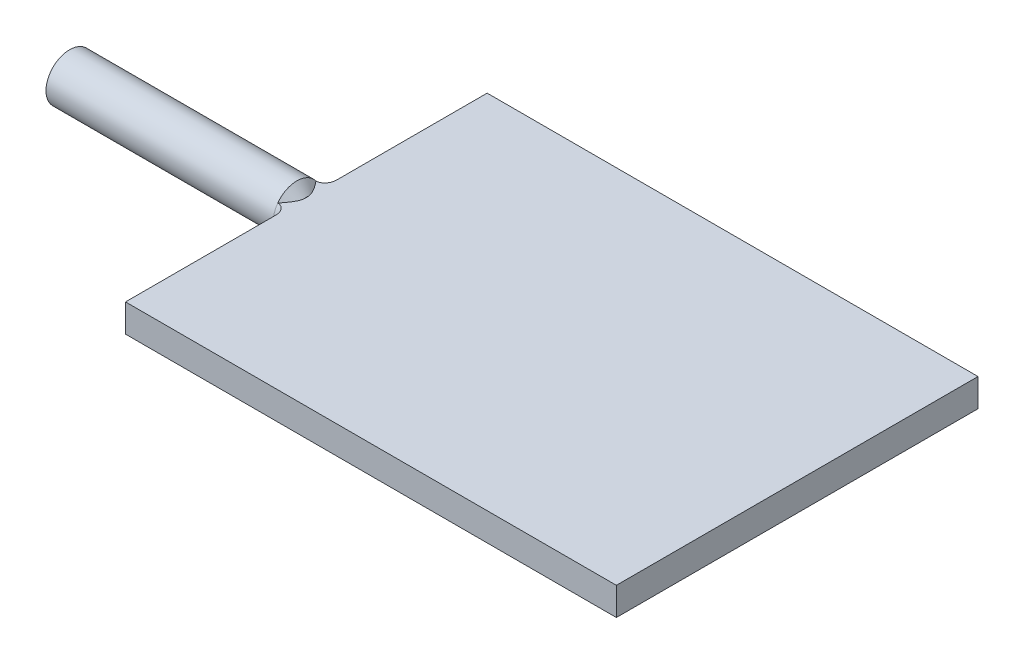
ISO-10303-21;
HEADER;
FILE_DESCRIPTION(('STEP AP214'),'2;1');
FILE_NAME('part.step','',(''),(''),'','','');
FILE_SCHEMA(('AUTOMOTIVE_DESIGN { 1 0 10303 214 1 1 1 1 }'));
ENDSEC;
DATA;
#1=APPLICATION_CONTEXT('core data for automotive mechanical design processes');
#2=APPLICATION_PROTOCOL_DEFINITION('international standard','automotive_design',2000,#1);
#3=PRODUCT_CONTEXT('',#1,'mechanical');
#4=PRODUCT('Part','Part','',(#3));
#5=PRODUCT_RELATED_PRODUCT_CATEGORY('part','',(#4));
#6=PRODUCT_DEFINITION_FORMATION('','',#4);
#7=PRODUCT_DEFINITION_CONTEXT('part definition',#1,'design');
#8=PRODUCT_DEFINITION('design','',#6,#7);
#9=PRODUCT_DEFINITION_SHAPE('','',#8);
#10=(LENGTH_UNIT() NAMED_UNIT(*) SI_UNIT(.MILLI.,.METRE.));
#11=(NAMED_UNIT(*) PLANE_ANGLE_UNIT() SI_UNIT($,.RADIAN.));
#12=(NAMED_UNIT(*) SI_UNIT($,.STERADIAN.) SOLID_ANGLE_UNIT());
#13=UNCERTAINTY_MEASURE_WITH_UNIT(LENGTH_MEASURE(1.E-05),#10,'distance_accuracy_value','');
#14=(GEOMETRIC_REPRESENTATION_CONTEXT(3) GLOBAL_UNCERTAINTY_ASSIGNED_CONTEXT((#13)) GLOBAL_UNIT_ASSIGNED_CONTEXT((#10,
#11,#12)) REPRESENTATION_CONTEXT('',''));
#15=CARTESIAN_POINT('',(0.,0.,0.));
#16=DIRECTION('',(0.,0.,1.));
#17=DIRECTION('',(1.,0.,0.));
#18=AXIS2_PLACEMENT_3D('',#15,#16,#17);
#19=CARTESIAN_POINT('',(-25.9625008107106,0.,0.));
#20=DIRECTION('',(-1.,0.,0.));
#21=DIRECTION('',(0.,0.,1.));
#22=AXIS2_PLACEMENT_3D('',#19,#20,#21);
#23=PLANE('',#22);
#24=DIRECTION('',(0.,0.,1.));
#25=VECTOR('',#24,1.);
#26=CARTESIAN_POINT('',(-25.9625008107106,5.35355371721896,0.));
#27=LINE('',#26,#25);
#28=CARTESIAN_POINT('',(-25.9625008107106,5.35355371721896,-32.0955552733691));
#29=VERTEX_POINT('',#28);
#30=CARTESIAN_POINT('',(-25.9625008107106,5.35355371721896,-16.1695708687939));
#31=VERTEX_POINT('',#30);
#32=EDGE_CURVE('E160',#29,#31,#27,.T.);
#33=ORIENTED_EDGE('',*,*,#32,.T.);
#34=CARTESIAN_POINT('',(-25.9625008107106,6.82855371721896,-12.9955552733691));
#35=DIRECTION('',(-1.,0.,0.));
#36=DIRECTION('',(0.,0.,1.));
#37=AXIS2_PLACEMENT_3D('',#34,#35,#36);
#38=CIRCLE('',#37,3.5);
#39=CARTESIAN_POINT('',(-25.9625008107106,8.30355371721896,-16.1695708687939));
#40=VERTEX_POINT('',#39);
#41=EDGE_CURVE('E193',#31,#40,#38,.F.);
#42=ORIENTED_EDGE('',*,*,#41,.T.);
#43=DIRECTION('',(0.,0.,1.));
#44=VECTOR('',#43,1.);
#45=CARTESIAN_POINT('',(-25.9625008107106,8.30355371721896,0.));
#46=LINE('',#45,#44);
#47=CARTESIAN_POINT('',(-25.9625008107106,8.30355371721896,-32.0955552733691));
#48=VERTEX_POINT('',#47);
#49=EDGE_CURVE('E181',#48,#40,#46,.T.);
#50=ORIENTED_EDGE('',*,*,#49,.F.);
#51=DIRECTION('',(0.,1.,0.));
#52=VECTOR('',#51,1.);
#53=CARTESIAN_POINT('',(-25.9625008107106,0.,-32.0955552733691));
#54=LINE('',#53,#52);
#55=EDGE_CURVE('E164',#29,#48,#54,.T.);
#56=ORIENTED_EDGE('',*,*,#55,.F.);
#57=EDGE_LOOP('',(#33,#42,#50,#56));
#58=FACE_BOUND('',#57,.T.);
#59=ADVANCED_FACE('F47',(#58),#23,.T.);
#60=CARTESIAN_POINT('',(25.8874991892894,0.0285537172189584,8.00444472663091));
#61=DIRECTION('',(1.,0.,0.));
#62=DIRECTION('',(0.,0.,-1.));
#63=AXIS2_PLACEMENT_3D('',#60,#61,#62);
#64=PLANE('',#63);
#65=DIRECTION('',(0.,0.,1.));
#66=VECTOR('',#65,1.);
#67=CARTESIAN_POINT('',(25.8874991892894,5.35355371721896,0.));
#68=LINE('',#67,#66);
#69=CARTESIAN_POINT('',(25.8874991892894,5.35355371721896,-32.0955552733691));
#70=VERTEX_POINT('',#69);
#71=CARTESIAN_POINT('',(25.8874991892894,5.35355371721896,6.10444472663094));
#72=VERTEX_POINT('',#71);
#73=EDGE_CURVE('E133',#70,#72,#68,.T.);
#74=ORIENTED_EDGE('',*,*,#73,.F.);
#75=DIRECTION('',(0.,1.,0.));
#76=VECTOR('',#75,1.);
#77=CARTESIAN_POINT('',(25.8874991892894,0.,-32.0955552733691));
#78=LINE('',#77,#76);
#79=CARTESIAN_POINT('',(25.8874991892894,8.30355371721896,-32.0955552733691));
#80=VERTEX_POINT('',#79);
#81=EDGE_CURVE('E166',#70,#80,#78,.T.);
#82=ORIENTED_EDGE('',*,*,#81,.T.);
#83=DIRECTION('',(0.,0.,1.));
#84=VECTOR('',#83,1.);
#85=CARTESIAN_POINT('',(25.8874991892894,8.30355371721896,0.));
#86=LINE('',#85,#84);
#87=CARTESIAN_POINT('',(25.8874991892894,8.30355371721896,6.10444472663094));
#88=VERTEX_POINT('',#87);
#89=EDGE_CURVE('E136',#80,#88,#86,.T.);
#90=ORIENTED_EDGE('',*,*,#89,.T.);
#91=DIRECTION('',(0.,1.,0.));
#92=VECTOR('',#91,1.);
#93=CARTESIAN_POINT('',(25.8874991892894,0.,6.10444472663095));
#94=LINE('',#93,#92);
#95=EDGE_CURVE('E129',#72,#88,#94,.T.);
#96=ORIENTED_EDGE('',*,*,#95,.F.);
#97=EDGE_LOOP('',(#74,#82,#90,#96));
#98=FACE_BOUND('',#97,.T.);
#99=ADVANCED_FACE('F131',(#98),#64,.T.);
#100=CARTESIAN_POINT('',(-25.9625008107106,8.30355371721896,-9.82153967794424));
#101=VERTEX_POINT('',#100);
#102=CARTESIAN_POINT('',(-25.9625008107106,8.30355371721896,6.10444472663094));
#103=VERTEX_POINT('',#102);
#104=EDGE_CURVE('E176',#101,#103,#46,.T.);
#105=ORIENTED_EDGE('',*,*,#104,.F.);
#106=CARTESIAN_POINT('',(-25.9625008107106,6.82855371721896,-12.9955552733691));
#107=DIRECTION('',(-1.,0.,0.));
#108=DIRECTION('',(0.,0.,1.));
#109=AXIS2_PLACEMENT_3D('',#106,#107,#108);
#110=CIRCLE('',#109,3.5);
#111=CARTESIAN_POINT('',(-25.9625008107106,5.35355371721896,-9.82153967794424));
#112=VERTEX_POINT('',#111);
#113=EDGE_CURVE('E190',#101,#112,#110,.F.);
#114=ORIENTED_EDGE('',*,*,#113,.T.);
#115=CARTESIAN_POINT('',(-25.9625008107106,5.35355371721896,6.10444472663094));
#116=VERTEX_POINT('',#115);
#117=EDGE_CURVE('E171',#112,#116,#27,.T.);
#118=ORIENTED_EDGE('',*,*,#117,.T.);
#119=DIRECTION('',(0.,1.,0.));
#120=VECTOR('',#119,1.);
#121=CARTESIAN_POINT('',(-25.9625008107106,0.,6.10444472663095));
#122=LINE('',#121,#120);
#123=EDGE_CURVE('E148',#116,#103,#122,.T.);
#124=ORIENTED_EDGE('',*,*,#123,.T.);
#125=EDGE_LOOP('',(#105,#114,#118,#124));
#126=FACE_BOUND('',#125,.T.);
#127=ADVANCED_FACE('F271',(#126),#23,.T.);
#128=CARTESIAN_POINT('',(64.2012369343855,5.35355371721896,0.));
#129=DIRECTION('',(0.,-1.,0.));
#130=DIRECTION('',(0.,0.,-1.));
#131=AXIS2_PLACEMENT_3D('',#128,#129,#130);
#132=PLANE('',#131);
#133=DIRECTION('',(-1.,0.,0.));
#134=VECTOR('',#133,1.);
#135=CARTESIAN_POINT('',(64.2012369343855,5.35355371721896,-32.0955552733691));
#136=LINE('',#135,#134);
#137=EDGE_CURVE('E156',#70,#29,#136,.T.);
#138=ORIENTED_EDGE('',*,*,#137,.F.);
#139=ORIENTED_EDGE('',*,*,#73,.T.);
#140=DIRECTION('',(-1.,0.,0.));
#141=VECTOR('',#140,1.);
#142=CARTESIAN_POINT('',(64.2012369343855,5.35355371721896,6.10444472663094));
#143=LINE('',#142,#141);
#144=EDGE_CURVE('E142',#72,#116,#143,.T.);
#145=ORIENTED_EDGE('',*,*,#144,.T.);
#146=ORIENTED_EDGE('',*,*,#117,.F.);
#147=CARTESIAN_POINT('',(-25.9625008107106,5.35355371721896,-9.82153967794424));
#148=CARTESIAN_POINT('',(-25.962484094963,5.35355371721896,-9.89187467344635));
#149=CARTESIAN_POINT('',(-25.9686019571848,5.35355371721896,-9.96215267421718));
#150=CARTESIAN_POINT('',(-25.9925023643657,5.35355371721896,-10.1006805559973));
#151=CARTESIAN_POINT('',(-26.0102811027526,5.35355371721896,-10.1689310912544));
#152=CARTESIAN_POINT('',(-26.0568896664572,5.35355371721896,-10.3015101259874));
#153=CARTESIAN_POINT('',(-26.0857147965335,5.35355371721896,-10.365840278366));
#154=CARTESIAN_POINT('',(-26.1538279048127,5.35355371721896,-10.4888042065305));
#155=CARTESIAN_POINT('',(-26.1931246732859,5.35355371721896,-10.5474331398088));
#156=CARTESIAN_POINT('',(-26.281239901939,5.35355371721896,-10.6564469058606));
#157=CARTESIAN_POINT('',(-26.3299933993752,5.35355371721896,-10.7068838990931));
#158=CARTESIAN_POINT('',(-26.4363642140638,5.35355371721896,-10.7973259330384));
#159=CARTESIAN_POINT('',(-26.493961594279,5.35355371721896,-10.8373539055617));
#160=CARTESIAN_POINT('',(-26.5979526138608,5.35355371721896,-10.8938151512285));
#161=CARTESIAN_POINT('',(-26.6424739374508,5.35355371721896,-10.9137232443705));
#162=CARTESIAN_POINT('',(-26.7341720523619,5.35355371721896,-10.9458266350178));
#163=CARTESIAN_POINT('',(-26.7813420236312,5.35355371721896,-10.9580408336687));
#164=CARTESIAN_POINT('',(-26.8511980265086,5.35355371721896,-10.9696649575082));
#165=CARTESIAN_POINT('',(-26.8733651947807,5.35355371721896,-10.9724277397145));
#166=CARTESIAN_POINT('',(-26.9178510987745,5.35355371721896,-10.9761196927852));
#167=CARTESIAN_POINT('',(-26.9401698320383,5.35355371721896,-10.9770488933122));
#168=CARTESIAN_POINT('',(-26.9625008107106,5.35355371721896,-10.9770471609256));
#169=B_SPLINE_CURVE_WITH_KNOTS('',3,(#147,#148,#149,#150,#151,#152,#153,#154,#155,#156,#157,
#158,#159,#160,#161,#162,#163,#164,#165,#166,#167,#168),.UNSPECIFIED.,.F.,.F.,(4,2,2,2,2,2,2,2,
2,2,4),(0.,0.210663224968583,0.421257715311609,0.631762792092616,0.842445134120881,
1.05172841676982,1.26054665076961,1.40627757815988,1.55164908608274,1.61860012310508,
1.68555007702655),.UNSPECIFIED.);
#170=CARTESIAN_POINT('',(-26.9625008107106,5.35355371721896,-10.9770471609256));
#171=VERTEX_POINT('',#170);
#172=EDGE_CURVE('E204',#112,#171,#169,.T.);
#173=ORIENTED_EDGE('',*,*,#172,.T.);
#174=CARTESIAN_POINT('',(-26.9625008107106,5.35355371721896,-10.9770471609256));
#175=CARTESIAN_POINT('',(-26.9260572958192,5.35355371721896,-11.0221884083712));
#176=CARTESIAN_POINT('',(-26.8898668249108,5.35355371721896,-11.0675331397574));
#177=CARTESIAN_POINT('',(-26.8180945749119,5.35355371721896,-11.1587129680251));
#178=CARTESIAN_POINT('',(-26.7825128924437,5.35355371721896,-11.2045481409035));
#179=CARTESIAN_POINT('',(-26.6765960016944,5.35355371721896,-11.3432283759509));
#180=CARTESIAN_POINT('',(-26.6073555634921,5.35355371721896,-11.4369210096202));
#181=CARTESIAN_POINT('',(-26.4748113764908,5.35355371721896,-11.6251067794884));
#182=CARTESIAN_POINT('',(-26.4114053985029,5.35355371721896,-11.7195274798546));
#183=CARTESIAN_POINT('',(-26.2909850687364,5.35355371721896,-11.9123106324631));
#184=CARTESIAN_POINT('',(-26.2339622413198,5.35355371721896,-12.0106676165533));
#185=CARTESIAN_POINT('',(-26.1573734437266,5.35355371721896,-12.1597056368222));
#186=CARTESIAN_POINT('',(-26.1338442038142,5.35355371721896,-12.2083449596867));
#187=CARTESIAN_POINT('',(-26.0897337740614,5.35355371721896,-12.3069248197489));
#188=CARTESIAN_POINT('',(-26.0691504373233,5.35355371721896,-12.3568643776737));
#189=CARTESIAN_POINT('',(-26.0125197096837,5.35355371721896,-12.5098219972791));
#190=CARTESIAN_POINT('',(-25.9821681566779,5.35355371721896,-12.6149231298414));
#191=CARTESIAN_POINT('',(-25.9625008107106,5.35355371721896,-12.7228374705031));
#192=B_SPLINE_CURVE_WITH_KNOTS('',3,(#174,#175,#176,#177,#178,#179,#180,#181,#182,#183,#184,
#185,#186,#187,#188,#189,#190,#191),.UNSPECIFIED.,.F.,.F.,(4,2,2,2,2,2,2,2,4),(0.,
0.174045037702846,0.348117446950531,0.69752792882364,1.03860169776259,1.37921707315341,
1.54124281275804,1.70314986429702,2.03053283076483),.UNSPECIFIED.);
#193=CARTESIAN_POINT('',(-25.9625008107106,5.35355371721896,-12.7228374705031));
#194=VERTEX_POINT('',#193);
#195=EDGE_CURVE('E257',#171,#194,#192,.T.);
#196=ORIENTED_EDGE('',*,*,#195,.T.);
#197=CARTESIAN_POINT('',(-25.9625008107106,5.35355371721896,-13.268273076235));
#198=VERTEX_POINT('',#197);
#199=EDGE_CURVE('E313',#198,#194,#27,.T.);
#200=ORIENTED_EDGE('',*,*,#199,.F.);
#201=CARTESIAN_POINT('',(-25.9625008107106,5.35355371721896,-13.268273076235));
#202=CARTESIAN_POINT('',(-25.9725328047005,5.35355371721896,-13.32353747275));
#203=CARTESIAN_POINT('',(-25.9854407813831,5.35355371721896,-13.378192508924));
#204=CARTESIAN_POINT('',(-26.0160537124483,5.35355371721896,-13.4860208157093));
#205=CARTESIAN_POINT('',(-26.0337476649625,5.35355371721896,-13.5391971800329));
#206=CARTESIAN_POINT('',(-26.0728169775644,5.35355371721896,-13.6434851681442));
#207=CARTESIAN_POINT('',(-26.0941499795691,5.35355371721896,-13.6946130082766));
#208=CARTESIAN_POINT('',(-26.1398654652352,5.35355371721896,-13.7955213796342));
#209=CARTESIAN_POINT('',(-26.16425035042,5.35355371721896,-13.8453008118547));
#210=CARTESIAN_POINT('',(-26.2416137510291,5.35355371721896,-13.9939976719577));
#211=CARTESIAN_POINT('',(-26.2982829337328,5.35355371721896,-14.0909859028182));
#212=CARTESIAN_POINT('',(-26.4177391964387,5.35355371721896,-14.2811614843125));
#213=CARTESIAN_POINT('',(-26.4805334680839,5.35355371721896,-14.3743441802176));
#214=CARTESIAN_POINT('',(-26.6116534023719,5.35355371721896,-14.5600528015904));
#215=CARTESIAN_POINT('',(-26.6800750220609,5.35355371721896,-14.6525105551229));
#216=CARTESIAN_POINT('',(-26.7847119812201,5.35355371721896,-14.7894035048766));
#217=CARTESIAN_POINT('',(-26.819864752722,5.35355371721896,-14.8346615276679));
#218=CARTESIAN_POINT('',(-26.8907630463143,5.35355371721896,-14.9247003261865));
#219=CARTESIAN_POINT('',(-26.926508479355,5.35355371721896,-14.96948117198));
#220=CARTESIAN_POINT('',(-26.9625008107106,5.35355371721896,-15.0140633858125));
#221=B_SPLINE_CURVE_WITH_KNOTS('',3,(#201,#202,#203,#204,#205,#206,#207,#208,#209,#210,#211,
#212,#213,#214,#215,#216,#217,#218,#219,#220),.UNSPECIFIED.,.F.,.F.,(4,2,2,2,2,2,2,2,2,4),(0.,
0.168302500672887,0.336221352805656,0.502304583922262,0.668519337290767,1.00509204384509,
1.34206479907549,1.68704150398379,1.85895722209314,2.03084733915975),.UNSPECIFIED.);
#222=CARTESIAN_POINT('',(-26.9625008107106,5.35355371721896,-15.0140633858125));
#223=VERTEX_POINT('',#222);
#224=EDGE_CURVE('E264',#198,#223,#221,.T.);
#225=ORIENTED_EDGE('',*,*,#224,.T.);
#226=CARTESIAN_POINT('',(-26.9625008107106,5.35355371721896,-15.0140633858125));
#227=CARTESIAN_POINT('',(-26.9377467315915,5.35355371721896,-15.0140592723813));
#228=CARTESIAN_POINT('',(-26.9130070291684,5.35355371721896,-15.015202717749));
#229=CARTESIAN_POINT('',(-26.8637500751804,5.35355371721896,-15.0197360932523));
#230=CARTESIAN_POINT('',(-26.8392326894085,5.35355371721896,-15.0231245619036));
#231=CARTESIAN_POINT('',(-26.7666204906992,5.35355371721896,-15.0365196406608));
#232=CARTESIAN_POINT('',(-26.7190894544443,5.35355371721896,-15.0497575427283));
#233=CARTESIAN_POINT('',(-26.6270660203878,5.35355371721896,-15.0839127739154));
#234=CARTESIAN_POINT('',(-26.5825669692952,5.35355371721896,-15.1048126011393));
#235=CARTESIAN_POINT('',(-26.4972324023015,5.35355371721896,-15.1531810433107));
#236=CARTESIAN_POINT('',(-26.4564031603462,5.35355371721896,-15.1806606239478));
#237=CARTESIAN_POINT('',(-26.3754967497171,5.35355371721896,-15.2438063010172));
#238=CARTESIAN_POINT('',(-26.3358251722485,5.35355371721896,-15.2799894398822));
#239=CARTESIAN_POINT('',(-26.2619882573708,5.35355371721896,-15.3575683927493));
#240=CARTESIAN_POINT('',(-26.2278245172685,5.35355371721896,-15.3989657127182));
#241=CARTESIAN_POINT('',(-26.1596869498881,5.35355371721896,-15.4937519398485));
#242=CARTESIAN_POINT('',(-26.1268486478346,5.35355371721896,-15.5479593500456));
#243=CARTESIAN_POINT('',(-26.0697084575558,5.35355371721896,-15.6607074744643));
#244=CARTESIAN_POINT('',(-26.0454108451435,5.35355371721896,-15.7192503414845));
#245=CARTESIAN_POINT('',(-26.0048957770253,5.35355371721896,-15.8421274542563));
#246=CARTESIAN_POINT('',(-25.9891089019432,5.35355371721896,-15.906604489524));
#247=CARTESIAN_POINT('',(-25.9679039408896,5.35355371721896,-16.0372311269488));
#248=CARTESIAN_POINT('',(-25.9624852109821,5.35355371721896,-16.1033806249756));
#249=CARTESIAN_POINT('',(-25.9625008107106,5.35355371721896,-16.1695708687939));
#250=B_SPLINE_CURVE_WITH_KNOTS('',3,(#226,#227,#228,#229,#230,#231,#232,#233,#234,#235,#236,
#237,#238,#239,#240,#241,#242,#243,#244,#245,#246,#247,#248,#249),.UNSPECIFIED.,.F.,.F.,(4,2,2,
2,2,2,2,2,2,2,2,4),(0.,0.0742085094819479,0.148368757477439,0.295577335201382,0.442451723153324,
0.589572614042776,0.750064336697729,0.910602519540108,1.09996596202427,1.28942407289346,
1.4877343967568,1.68603240373193),.UNSPECIFIED.);
#251=EDGE_CURVE('E231',#223,#31,#250,.T.);
#252=ORIENTED_EDGE('',*,*,#251,.T.);
#253=ORIENTED_EDGE('',*,*,#32,.F.);
#254=EDGE_LOOP('',(#138,#139,#145,#146,#173,#196,#200,#225,#252,#253));
#255=FACE_BOUND('',#254,.T.);
#256=ADVANCED_FACE('F154',(#255),#132,.T.);
#257=CARTESIAN_POINT('',(64.2012369343855,0.,6.10444472663095));
#258=DIRECTION('',(0.,0.,1.));
#259=DIRECTION('',(0.,-1.,0.));
#260=AXIS2_PLACEMENT_3D('',#257,#258,#259);
#261=PLANE('',#260);
#262=ORIENTED_EDGE('',*,*,#144,.F.);
#263=ORIENTED_EDGE('',*,*,#95,.T.);
#264=DIRECTION('',(-1.,0.,0.));
#265=VECTOR('',#264,1.);
#266=CARTESIAN_POINT('',(64.2012369343855,8.30355371721896,6.10444472663094));
#267=LINE('',#266,#265);
#268=EDGE_CURVE('E141',#88,#103,#267,.T.);
#269=ORIENTED_EDGE('',*,*,#268,.T.);
#270=ORIENTED_EDGE('',*,*,#123,.F.);
#271=EDGE_LOOP('',(#262,#263,#269,#270));
#272=FACE_BOUND('',#271,.T.);
#273=ADVANCED_FACE('F146',(#272),#261,.T.);
#274=CARTESIAN_POINT('',(64.2012369343855,8.30355371721896,0.));
#275=DIRECTION('',(0.,-1.,0.));
#276=DIRECTION('',(0.,0.,-1.));
#277=AXIS2_PLACEMENT_3D('',#274,#275,#276);
#278=PLANE('',#277);
#279=ORIENTED_EDGE('',*,*,#89,.F.);
#280=DIRECTION('',(-1.,0.,0.));
#281=VECTOR('',#280,1.);
#282=CARTESIAN_POINT('',(64.2012369343855,8.30355371721896,-32.0955552733691));
#283=LINE('',#282,#281);
#284=EDGE_CURVE('E173',#80,#48,#283,.T.);
#285=ORIENTED_EDGE('',*,*,#284,.T.);
#286=ORIENTED_EDGE('',*,*,#49,.T.);
#287=CARTESIAN_POINT('',(-25.9625008107106,8.30355371721896,-16.1695708687939));
#288=CARTESIAN_POINT('',(-25.962484094963,8.30355371721896,-16.0992358732918));
#289=CARTESIAN_POINT('',(-25.9686019571848,8.30355371721896,-16.028957872521));
#290=CARTESIAN_POINT('',(-25.9925023643657,8.30355371721896,-15.8904299907409));
#291=CARTESIAN_POINT('',(-26.0102811027526,8.30355371721896,-15.8221794554838));
#292=CARTESIAN_POINT('',(-26.0568896664572,8.30355371721896,-15.6896004207507));
#293=CARTESIAN_POINT('',(-26.0857147965335,8.30355371721896,-15.6252702683721));
#294=CARTESIAN_POINT('',(-26.1538279048127,8.30355371721896,-15.5023063402076));
#295=CARTESIAN_POINT('',(-26.1931246732859,8.30355371721896,-15.4436774069294));
#296=CARTESIAN_POINT('',(-26.281239901939,8.30355371721896,-15.3346636408776));
#297=CARTESIAN_POINT('',(-26.3299933993752,8.30355371721896,-15.284226647645));
#298=CARTESIAN_POINT('',(-26.4363642140638,8.30355371721896,-15.1937846136998));
#299=CARTESIAN_POINT('',(-26.493961594279,8.30355371721896,-15.1537566411765));
#300=CARTESIAN_POINT('',(-26.5979526138608,8.30355371721896,-15.0972953955096));
#301=CARTESIAN_POINT('',(-26.6424739374508,8.30355371721896,-15.0773873023676));
#302=CARTESIAN_POINT('',(-26.7341720523619,8.30355371721896,-15.0452839117204));
#303=CARTESIAN_POINT('',(-26.7813420236312,8.30355371721896,-15.0330697130694));
#304=CARTESIAN_POINT('',(-26.8511980265086,8.30355371721896,-15.0214455892299));
#305=CARTESIAN_POINT('',(-26.8733651947807,8.30355371721896,-15.0186828070237));
#306=CARTESIAN_POINT('',(-26.9178510987745,8.30355371721896,-15.0149908539529));
#307=CARTESIAN_POINT('',(-26.9401698320383,8.30355371721896,-15.0140616534259));
#308=CARTESIAN_POINT('',(-26.9625008107106,8.30355371721896,-15.0140633858125));
#309=B_SPLINE_CURVE_WITH_KNOTS('',3,(#287,#288,#289,#290,#291,#292,#293,#294,#295,#296,#297,
#298,#299,#300,#301,#302,#303,#304,#305,#306,#307,#308),.UNSPECIFIED.,.F.,.F.,(4,2,2,2,2,2,2,2,
2,2,4),(0.,0.210663224968583,0.42125771531161,0.631762792092621,0.842445134120884,
1.05172841676983,1.26054665076961,1.40627757815988,1.55164908608273,1.61860012310508,
1.68555007702655),.UNSPECIFIED.);
#310=CARTESIAN_POINT('',(-26.9625008107106,8.30355371721896,-15.0140633858125));
#311=VERTEX_POINT('',#310);
#312=EDGE_CURVE('E237',#40,#311,#309,.T.);
#313=ORIENTED_EDGE('',*,*,#312,.T.);
#314=CARTESIAN_POINT('',(-26.9625008107107,8.30355371721896,-15.0140633858125));
#315=CARTESIAN_POINT('',(-26.9260572958193,8.30355371721896,-14.9689221383669));
#316=CARTESIAN_POINT('',(-26.8898668249109,8.30355371721896,-14.9235774069808));
#317=CARTESIAN_POINT('',(-26.818094574912,8.30355371721896,-14.832397578713));
#318=CARTESIAN_POINT('',(-26.7825128924437,8.30355371721896,-14.7865624058347));
#319=CARTESIAN_POINT('',(-26.6765960016945,8.30355371721896,-14.6478821707873));
#320=CARTESIAN_POINT('',(-26.6073555634922,8.30355371721896,-14.554189537118));
#321=CARTESIAN_POINT('',(-26.4748113764909,8.30355371721896,-14.3660037672498));
#322=CARTESIAN_POINT('',(-26.411405398503,8.30355371721896,-14.2715830668836));
#323=CARTESIAN_POINT('',(-26.2909850687365,8.30355371721896,-14.0787999142752));
#324=CARTESIAN_POINT('',(-26.23396224132,8.30355371721896,-13.980442930185));
#325=CARTESIAN_POINT('',(-26.1573734437267,8.30355371721896,-13.8314049099161));
#326=CARTESIAN_POINT('',(-26.1338442038144,8.30355371721896,-13.7827655870516));
#327=CARTESIAN_POINT('',(-26.0897337740615,8.30355371721896,-13.6841857269893));
#328=CARTESIAN_POINT('',(-26.0691504373233,8.30355371721896,-13.6342461690645));
#329=CARTESIAN_POINT('',(-26.0125197096838,8.30355371721896,-13.481288549459));
#330=CARTESIAN_POINT('',(-25.9821681566779,8.30355371721896,-13.3761874168966));
#331=CARTESIAN_POINT('',(-25.9625008107106,8.30355371721896,-13.2682730762348));
#332=B_SPLINE_CURVE_WITH_KNOTS('',3,(#314,#315,#316,#317,#318,#319,#320,#321,#322,#323,#324,
#325,#326,#327,#328,#329,#330,#331),.UNSPECIFIED.,.F.,.F.,(4,2,2,2,2,2,2,2,4),(0.,
0.174045037702818,0.348117446950467,0.697527928823517,1.03860169776241,1.37921707315317,
1.54124281275792,1.70314986429702,2.03053283076507),.UNSPECIFIED.);
#333=CARTESIAN_POINT('',(-25.9625008107106,8.30355371721896,-13.2682730762348));
#334=VERTEX_POINT('',#333);
#335=EDGE_CURVE('E63',#311,#334,#332,.T.);
#336=ORIENTED_EDGE('',*,*,#335,.T.);
#337=CARTESIAN_POINT('',(-25.9625008107106,8.30355371721896,-12.7228374705033));
#338=VERTEX_POINT('',#337);
#339=EDGE_CURVE('E295',#334,#338,#46,.T.);
#340=ORIENTED_EDGE('',*,*,#339,.T.);
#341=CARTESIAN_POINT('',(-25.9625008107106,8.30355371721896,-12.7228374705033));
#342=CARTESIAN_POINT('',(-25.9725328047005,8.30355371721896,-12.6675730739884));
#343=CARTESIAN_POINT('',(-25.9854407813831,8.30355371721896,-12.6129180378144));
#344=CARTESIAN_POINT('',(-26.0160537124482,8.30355371721896,-12.5050897310291));
#345=CARTESIAN_POINT('',(-26.0337476649624,8.30355371721896,-12.4519133667056));
#346=CARTESIAN_POINT('',(-26.0728169775644,8.30355371721896,-12.3476253785943));
#347=CARTESIAN_POINT('',(-26.094149979569,8.30355371721896,-12.2964975384618));
#348=CARTESIAN_POINT('',(-26.139865465235,8.30355371721896,-12.1955891671043));
#349=CARTESIAN_POINT('',(-26.1642503504199,8.30355371721896,-12.1458097348838));
#350=CARTESIAN_POINT('',(-26.241613751029,8.30355371721896,-11.9971128747807));
#351=CARTESIAN_POINT('',(-26.2982829337326,8.30355371721896,-11.9001246439202));
#352=CARTESIAN_POINT('',(-26.4177391964385,8.30355371721896,-11.7099490624259));
#353=CARTESIAN_POINT('',(-26.4805334680838,8.30355371721896,-11.6167663665208));
#354=CARTESIAN_POINT('',(-26.6116534023719,8.30355371721896,-11.4310577451479));
#355=CARTESIAN_POINT('',(-26.6800750220609,8.30355371721896,-11.3385999916154));
#356=CARTESIAN_POINT('',(-26.7847119812201,8.30355371721896,-11.2017070418616));
#357=CARTESIAN_POINT('',(-26.819864752722,8.30355371721896,-11.1564490190702));
#358=CARTESIAN_POINT('',(-26.8907630463143,8.30355371721896,-11.0664102205516));
#359=CARTESIAN_POINT('',(-26.926508479355,8.30355371721896,-11.0216293747582));
#360=CARTESIAN_POINT('',(-26.9625008107107,8.30355371721896,-10.9770471609256));
#361=B_SPLINE_CURVE_WITH_KNOTS('',3,(#341,#342,#343,#344,#345,#346,#347,#348,#349,#350,#351,
#352,#353,#354,#355,#356,#357,#358,#359,#360),.UNSPECIFIED.,.F.,.F.,(4,2,2,2,2,2,2,2,2,4),(0.,
0.168302500672847,0.336221352805573,0.502304583922142,0.668519337290602,1.00509204384502,
1.34206479907552,1.68704150398392,1.85895722209332,2.03084733915999),.UNSPECIFIED.);
#362=CARTESIAN_POINT('',(-26.9625008107106,8.30355371721896,-10.9770471609256));
#363=VERTEX_POINT('',#362);
#364=EDGE_CURVE('E11',#338,#363,#361,.T.);
#365=ORIENTED_EDGE('',*,*,#364,.T.);
#366=CARTESIAN_POINT('',(-26.9625008107106,8.30355371721896,-10.9770471609256));
#367=CARTESIAN_POINT('',(-26.9377467315915,8.30355371721896,-10.9770512743568));
#368=CARTESIAN_POINT('',(-26.9130070291684,8.30355371721896,-10.9759078289892));
#369=CARTESIAN_POINT('',(-26.8637500751804,8.30355371721896,-10.9713744534858));
#370=CARTESIAN_POINT('',(-26.8392326894085,8.30355371721896,-10.9679859848345));
#371=CARTESIAN_POINT('',(-26.7666204906992,8.30355371721896,-10.9545909060773));
#372=CARTESIAN_POINT('',(-26.7190894544443,8.30355371721896,-10.9413530040098));
#373=CARTESIAN_POINT('',(-26.6270660203878,8.30355371721896,-10.9071977728227));
#374=CARTESIAN_POINT('',(-26.5825669692952,8.30355371721896,-10.8862979455988));
#375=CARTESIAN_POINT('',(-26.4972324023015,8.30355371721896,-10.8379295034275));
#376=CARTESIAN_POINT('',(-26.4564031603462,8.30355371721896,-10.8104499227903));
#377=CARTESIAN_POINT('',(-26.3754967497171,8.30355371721896,-10.747304245721));
#378=CARTESIAN_POINT('',(-26.3358251722485,8.30355371721896,-10.711121106856));
#379=CARTESIAN_POINT('',(-26.2619882573708,8.30355371721896,-10.6335421539889));
#380=CARTESIAN_POINT('',(-26.2278245172685,8.30355371721896,-10.5921448340199));
#381=CARTESIAN_POINT('',(-26.1596869498881,8.30355371721896,-10.4973586068897));
#382=CARTESIAN_POINT('',(-26.1268486478346,8.30355371721896,-10.4431511966925));
#383=CARTESIAN_POINT('',(-26.0697084575558,8.30355371721896,-10.3304030722739));
#384=CARTESIAN_POINT('',(-26.0454108451435,8.30355371721896,-10.2718602052536));
#385=CARTESIAN_POINT('',(-26.0048957770253,8.30355371721896,-10.1489830924818));
#386=CARTESIAN_POINT('',(-25.9891089019432,8.30355371721896,-10.0845060572142));
#387=CARTESIAN_POINT('',(-25.9679039408896,8.30355371721896,-9.95387941978932));
#388=CARTESIAN_POINT('',(-25.9624852109821,8.30355371721896,-9.88772992176257));
#389=CARTESIAN_POINT('',(-25.9625008107106,8.30355371721896,-9.82153967794424));
#390=B_SPLINE_CURVE_WITH_KNOTS('',3,(#366,#367,#368,#369,#370,#371,#372,#373,#374,#375,#376,
#377,#378,#379,#380,#381,#382,#383,#384,#385,#386,#387,#388,#389),.UNSPECIFIED.,.F.,.F.,(4,2,2,
2,2,2,2,2,2,2,2,4),(0.,0.0742085094819479,0.148368757477439,0.295577335201382,0.442451723153324,
0.589572614042776,0.750064336697729,0.910602519540108,1.09996596202427,1.28942407289346,
1.4877343967568,1.68603240373193),.UNSPECIFIED.);
#391=EDGE_CURVE('E196',#363,#101,#390,.T.);
#392=ORIENTED_EDGE('',*,*,#391,.T.);
#393=ORIENTED_EDGE('',*,*,#104,.T.);
#394=ORIENTED_EDGE('',*,*,#268,.F.);
#395=EDGE_LOOP('',(#279,#285,#286,#313,#336,#340,#365,#392,#393,#394));
#396=FACE_BOUND('',#395,.T.);
#397=ADVANCED_FACE('F211',(#396),#278,.F.);
#398=CARTESIAN_POINT('',(64.2012369343855,0.,-32.0955552733691));
#399=DIRECTION('',(0.,0.,1.));
#400=DIRECTION('',(1.,0.,0.));
#401=AXIS2_PLACEMENT_3D('',#398,#399,#400);
#402=PLANE('',#401);
#403=ORIENTED_EDGE('',*,*,#81,.F.);
#404=ORIENTED_EDGE('',*,*,#137,.T.);
#405=ORIENTED_EDGE('',*,*,#55,.T.);
#406=ORIENTED_EDGE('',*,*,#284,.F.);
#407=EDGE_LOOP('',(#403,#404,#405,#406));
#408=FACE_BOUND('',#407,.T.);
#409=ADVANCED_FACE('F279',(#408),#402,.F.);
#410=CARTESIAN_POINT('',(-25.9625008107106,6.82855371721896,-12.9955552733691));
#411=DIRECTION('',(-1.,0.,0.));
#412=DIRECTION('',(0.,0.,1.));
#413=AXIS2_PLACEMENT_3D('',#410,#411,#412);
#414=PLANE('',#413);
#415=ORIENTED_EDGE('',*,*,#199,.T.);
#416=CARTESIAN_POINT('',(-25.9625008107106,6.82855371721896,-12.9955552733691));
#417=DIRECTION('',(-1.,0.,0.));
#418=DIRECTION('',(0.,0.,1.));
#419=AXIS2_PLACEMENT_3D('',#416,#417,#418);
#420=CIRCLE('',#419,1.50000000000002);
#421=EDGE_CURVE('E252',#194,#198,#420,.F.);
#422=ORIENTED_EDGE('',*,*,#421,.T.);
#423=EDGE_LOOP('',(#415,#422));
#424=FACE_BOUND('',#423,.T.);
#425=ADVANCED_FACE('F328',(#424),#414,.F.);
#426=CARTESIAN_POINT('',(-50.9625008107106,6.82855371721896,-12.9955552733691));
#427=DIRECTION('',(1.,0.,0.));
#428=DIRECTION('',(0.,0.,-1.));
#429=AXIS2_PLACEMENT_3D('',#426,#427,#428);
#430=CYLINDRICAL_SURFACE('',#429,2.5);
#431=CARTESIAN_POINT('',(-50.9625008107106,6.82855371721896,-12.9955552733691));
#432=DIRECTION('',(-1.,0.,0.));
#433=DIRECTION('',(0.,0.,1.));
#434=AXIS2_PLACEMENT_3D('',#431,#432,#433);
#435=CIRCLE('',#434,2.5);
#436=CARTESIAN_POINT('',(-50.9625008107106,6.82855371721896,-10.4955552733691));
#437=VERTEX_POINT('',#436);
#438=EDGE_CURVE('E169',#437,#437,#435,.T.);
#439=ORIENTED_EDGE('',*,*,#438,.F.);
#440=EDGE_LOOP('',(#439));
#441=FACE_BOUND('',#440,.T.);
#442=CARTESIAN_POINT('',(-26.9625008107106,6.82855371721896,-12.9955552733691));
#443=DIRECTION('',(-1.,0.,0.));
#444=DIRECTION('',(0.,0.,1.));
#445=AXIS2_PLACEMENT_3D('',#442,#443,#444);
#446=CIRCLE('',#445,2.5);
#447=EDGE_CURVE('E182',#311,#223,#446,.T.);
#448=ORIENTED_EDGE('',*,*,#447,.T.);
#449=CARTESIAN_POINT('',(-26.9625008107106,6.82855371721896,-12.9955552733691));
#450=DIRECTION('',(-1.,0.,0.));
#451=DIRECTION('',(0.,0.,1.));
#452=AXIS2_PLACEMENT_3D('',#449,#450,#451);
#453=CIRCLE('',#452,2.5);
#454=EDGE_CURVE('E248',#223,#171,#453,.T.);
#455=ORIENTED_EDGE('',*,*,#454,.T.);
#456=CARTESIAN_POINT('',(-26.9625008107106,6.82855371721896,-12.9955552733691));
#457=DIRECTION('',(-1.,0.,0.));
#458=DIRECTION('',(0.,0.,1.));
#459=AXIS2_PLACEMENT_3D('',#456,#457,#458);
#460=CIRCLE('',#459,2.5);
#461=EDGE_CURVE('E186',#171,#363,#460,.T.);
#462=ORIENTED_EDGE('',*,*,#461,.T.);
#463=CARTESIAN_POINT('',(-26.9625008107107,6.82855371721896,-12.9955552733691));
#464=DIRECTION('',(-1.,0.,0.));
#465=DIRECTION('',(0.,0.,1.));
#466=AXIS2_PLACEMENT_3D('',#463,#464,#465);
#467=CIRCLE('',#466,2.5);
#468=EDGE_CURVE('E244',#363,#311,#467,.T.);
#469=ORIENTED_EDGE('',*,*,#468,.T.);
#470=EDGE_LOOP('',(#448,#455,#462,#469));
#471=FACE_BOUND('',#470,.T.);
#472=ADVANCED_FACE('F325',(#441,#471),#430,.T.);
#473=CARTESIAN_POINT('',(-50.9625008107106,6.82855371721896,-12.9955552733691));
#474=DIRECTION('',(-1.,0.,0.));
#475=DIRECTION('',(0.,0.,1.));
#476=AXIS2_PLACEMENT_3D('',#473,#474,#475);
#477=PLANE('',#476);
#478=ORIENTED_EDGE('',*,*,#438,.T.);
#479=EDGE_LOOP('',(#478));
#480=FACE_BOUND('',#479,.T.);
#481=ADVANCED_FACE('F323',(#480),#477,.T.);
#482=ORIENTED_EDGE('',*,*,#339,.F.);
#483=CARTESIAN_POINT('',(-25.9625008107106,6.82855371721896,-12.9955552733691));
#484=DIRECTION('',(-1.,0.,0.));
#485=DIRECTION('',(0.,0.,1.));
#486=AXIS2_PLACEMENT_3D('',#483,#484,#485);
#487=CIRCLE('',#486,1.49999999999997);
#488=EDGE_CURVE('E69',#334,#338,#487,.F.);
#489=ORIENTED_EDGE('',*,*,#488,.T.);
#490=EDGE_LOOP('',(#482,#489));
#491=FACE_BOUND('',#490,.T.);
#492=ADVANCED_FACE('F221',(#491),#414,.F.);
#493=CARTESIAN_POINT('',(-26.9625008107106,6.82855371721896,-12.9955552733691));
#494=DIRECTION('',(-1.,0.,0.));
#495=DIRECTION('',(0.,0.,1.));
#496=AXIS2_PLACEMENT_3D('',#493,#494,#495);
#497=TOROIDAL_SURFACE('',#496,3.5,1.);
#498=ORIENTED_EDGE('',*,*,#172,.F.);
#499=ORIENTED_EDGE('',*,*,#113,.F.);
#500=ORIENTED_EDGE('',*,*,#391,.F.);
#501=ORIENTED_EDGE('',*,*,#461,.F.);
#502=EDGE_LOOP('',(#498,#499,#500,#501));
#503=FACE_BOUND('',#502,.T.);
#504=ADVANCED_FACE('F215',(#503),#497,.F.);
#505=CARTESIAN_POINT('',(-26.9625008107106,6.82855371721896,-12.9955552733691));
#506=DIRECTION('',(-1.,0.,0.));
#507=DIRECTION('',(0.,0.,1.));
#508=AXIS2_PLACEMENT_3D('',#505,#506,#507);
#509=TOROIDAL_SURFACE('',#508,3.5,1.);
#510=ORIENTED_EDGE('',*,*,#312,.F.);
#511=ORIENTED_EDGE('',*,*,#41,.F.);
#512=ORIENTED_EDGE('',*,*,#251,.F.);
#513=ORIENTED_EDGE('',*,*,#447,.F.);
#514=EDGE_LOOP('',(#510,#511,#512,#513));
#515=FACE_BOUND('',#514,.T.);
#516=ADVANCED_FACE('F220',(#515),#509,.F.);
#517=CARTESIAN_POINT('',(-26.9625008107106,6.82855371721896,-12.9955552733691));
#518=DIRECTION('',(-1.,0.,0.));
#519=DIRECTION('',(0.,0.,1.));
#520=AXIS2_PLACEMENT_3D('',#517,#518,#519);
#521=CONICAL_SURFACE('',#520,2.5,0.785398163397453);
#522=ORIENTED_EDGE('',*,*,#224,.F.);
#523=ORIENTED_EDGE('',*,*,#421,.F.);
#524=ORIENTED_EDGE('',*,*,#195,.F.);
#525=ORIENTED_EDGE('',*,*,#454,.F.);
#526=EDGE_LOOP('',(#522,#523,#524,#525));
#527=FACE_BOUND('',#526,.T.);
#528=ADVANCED_FACE('F226',(#527),#521,.T.);
#529=CARTESIAN_POINT('',(-26.9625008107107,6.82855371721896,-12.9955552733691));
#530=DIRECTION('',(-1.,0.,0.));
#531=DIRECTION('',(0.,0.,1.));
#532=AXIS2_PLACEMENT_3D('',#529,#530,#531);
#533=CONICAL_SURFACE('',#532,2.5,0.785398163397453);
#534=ORIENTED_EDGE('',*,*,#364,.F.);
#535=ORIENTED_EDGE('',*,*,#488,.F.);
#536=ORIENTED_EDGE('',*,*,#335,.F.);
#537=ORIENTED_EDGE('',*,*,#468,.F.);
#538=EDGE_LOOP('',(#534,#535,#536,#537));
#539=FACE_BOUND('',#538,.T.);
#540=ADVANCED_FACE('F50',(#539),#533,.T.);
#541=CLOSED_SHELL('',(#59,#99,#127,#256,#273,#397,#409,#425,#472,#481,#492,#504,#516,#528,#540));
#542=MANIFOLD_SOLID_BREP('B2',#541);
#543=ADVANCED_BREP_SHAPE_REPRESENTATION('',(#18,#542),#14);
#544=SHAPE_DEFINITION_REPRESENTATION(#9,#543);
ENDSEC;
END-ISO-10303-21;
